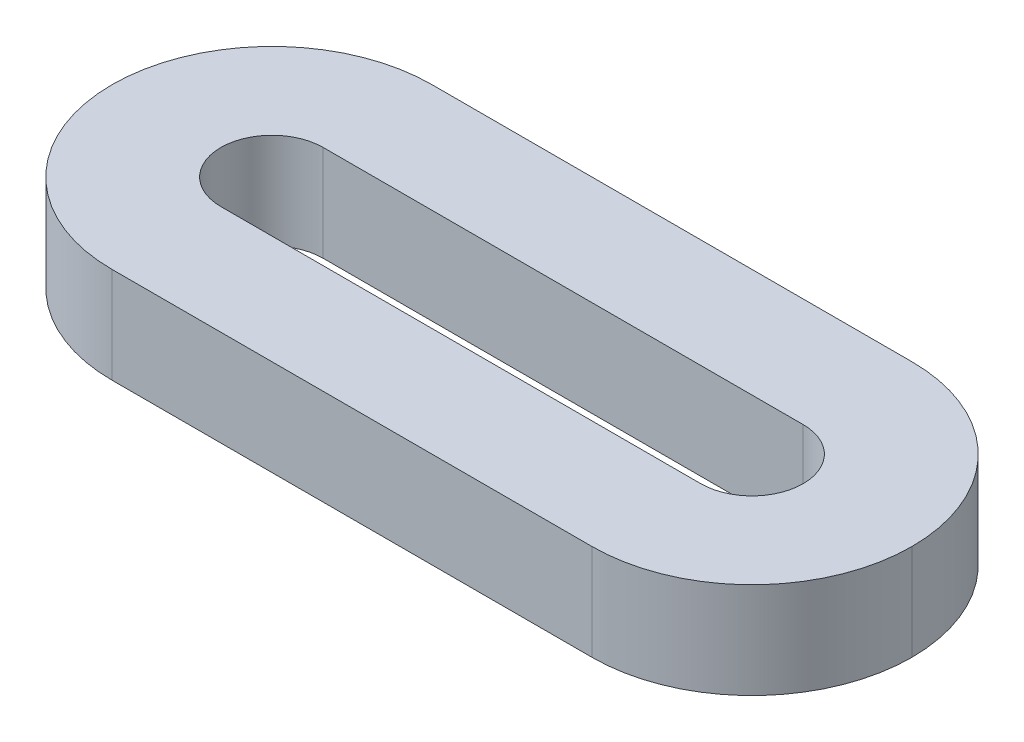
ISO-10303-21;
HEADER;
FILE_DESCRIPTION(('STEP AP214'),'2;1');
FILE_NAME('part.step','',(''),(''),'','','');
FILE_SCHEMA(('AUTOMOTIVE_DESIGN { 1 0 10303 214 1 1 1 1 }'));
ENDSEC;
DATA;
#1=APPLICATION_CONTEXT('core data for automotive mechanical design processes');
#2=APPLICATION_PROTOCOL_DEFINITION('international standard','automotive_design',2000,#1);
#3=PRODUCT_CONTEXT('',#1,'mechanical');
#4=PRODUCT('Part','Part','',(#3));
#5=PRODUCT_RELATED_PRODUCT_CATEGORY('part','',(#4));
#6=PRODUCT_DEFINITION_FORMATION('','',#4);
#7=PRODUCT_DEFINITION_CONTEXT('part definition',#1,'design');
#8=PRODUCT_DEFINITION('design','',#6,#7);
#9=PRODUCT_DEFINITION_SHAPE('','',#8);
#10=(LENGTH_UNIT() NAMED_UNIT(*) SI_UNIT(.MILLI.,.METRE.));
#11=(NAMED_UNIT(*) PLANE_ANGLE_UNIT() SI_UNIT($,.RADIAN.));
#12=(NAMED_UNIT(*) SI_UNIT($,.STERADIAN.) SOLID_ANGLE_UNIT());
#13=UNCERTAINTY_MEASURE_WITH_UNIT(LENGTH_MEASURE(1.E-05),#10,'distance_accuracy_value','');
#14=(GEOMETRIC_REPRESENTATION_CONTEXT(3) GLOBAL_UNCERTAINTY_ASSIGNED_CONTEXT((#13)) GLOBAL_UNIT_ASSIGNED_CONTEXT((#10,
#11,#12)) REPRESENTATION_CONTEXT('',''));
#15=CARTESIAN_POINT('',(0.,0.,0.));
#16=DIRECTION('',(0.,0.,1.));
#17=DIRECTION('',(1.,0.,0.));
#18=AXIS2_PLACEMENT_3D('',#15,#16,#17);
#19=CARTESIAN_POINT('',(0.,3.,0.));
#20=DIRECTION('',(0.,1.,0.));
#21=DIRECTION('',(0.,0.,1.));
#22=AXIS2_PLACEMENT_3D('',#19,#20,#21);
#23=PLANE('',#22);
#24=DIRECTION('',(1.,0.,0.));
#25=VECTOR('',#24,1.);
#26=CARTESIAN_POINT('',(-20.,3.,5.));
#27=LINE('',#26,#25);
#28=CARTESIAN_POINT('',(-15.,3.,5.));
#29=VERTEX_POINT('',#28);
#30=CARTESIAN_POINT('',(0.,3.,5.));
#31=VERTEX_POINT('',#30);
#32=EDGE_CURVE('E181',#29,#31,#27,.T.);
#33=ORIENTED_EDGE('',*,*,#32,.T.);
#34=CARTESIAN_POINT('',(0.,3.,0.));
#35=DIRECTION('',(0.,1.,0.));
#36=DIRECTION('',(0.,0.,1.));
#37=AXIS2_PLACEMENT_3D('',#34,#35,#36);
#38=CIRCLE('',#37,5.);
#39=CARTESIAN_POINT('',(5.,3.,0.));
#40=VERTEX_POINT('',#39);
#41=EDGE_CURVE('E221',#31,#40,#38,.T.);
#42=ORIENTED_EDGE('',*,*,#41,.T.);
#43=CARTESIAN_POINT('',(0.,3.,0.));
#44=DIRECTION('',(0.,1.,0.));
#45=DIRECTION('',(0.,0.,1.));
#46=AXIS2_PLACEMENT_3D('',#43,#44,#45);
#47=CIRCLE('',#46,5.);
#48=CARTESIAN_POINT('',(0.,3.,-5.));
#49=VERTEX_POINT('',#48);
#50=EDGE_CURVE('E71',#40,#49,#47,.T.);
#51=ORIENTED_EDGE('',*,*,#50,.T.);
#52=DIRECTION('',(-1.,0.,0.));
#53=VECTOR('',#52,1.);
#54=CARTESIAN_POINT('',(-20.,3.,-5.));
#55=LINE('',#54,#53);
#56=CARTESIAN_POINT('',(-15.,3.,-5.));
#57=VERTEX_POINT('',#56);
#58=EDGE_CURVE('E185',#49,#57,#55,.T.);
#59=ORIENTED_EDGE('',*,*,#58,.T.);
#60=CARTESIAN_POINT('',(-15.,3.,0.));
#61=DIRECTION('',(0.,1.,0.));
#62=DIRECTION('',(0.,0.,1.));
#63=AXIS2_PLACEMENT_3D('',#60,#61,#62);
#64=CIRCLE('',#63,5.);
#65=CARTESIAN_POINT('',(-20.,3.,0.));
#66=VERTEX_POINT('',#65);
#67=EDGE_CURVE('E63',#57,#66,#64,.T.);
#68=ORIENTED_EDGE('',*,*,#67,.T.);
#69=CARTESIAN_POINT('',(-15.,3.,0.));
#70=DIRECTION('',(0.,1.,0.));
#71=DIRECTION('',(0.,0.,1.));
#72=AXIS2_PLACEMENT_3D('',#69,#70,#71);
#73=CIRCLE('',#72,5.);
#74=EDGE_CURVE('E214',#66,#29,#73,.T.);
#75=ORIENTED_EDGE('',*,*,#74,.T.);
#76=EDGE_LOOP('',(#33,#42,#51,#59,#68,#75));
#77=FACE_BOUND('',#76,.T.);
#78=DIRECTION('',(-1.,0.,0.));
#79=VECTOR('',#78,1.);
#80=CARTESIAN_POINT('',(0.,3.,-1.6));
#81=LINE('',#80,#79);
#82=CARTESIAN_POINT('',(0.,3.,-1.6));
#83=VERTEX_POINT('',#82);
#84=CARTESIAN_POINT('',(-15.,3.,-1.6));
#85=VERTEX_POINT('',#84);
#86=EDGE_CURVE('E138',#83,#85,#81,.T.);
#87=ORIENTED_EDGE('',*,*,#86,.F.);
#88=CARTESIAN_POINT('',(0.,3.,0.));
#89=DIRECTION('',(0.,1.,0.));
#90=DIRECTION('',(0.,0.,1.));
#91=AXIS2_PLACEMENT_3D('',#88,#89,#90);
#92=CIRCLE('',#91,1.6);
#93=CARTESIAN_POINT('',(0.,3.,1.6));
#94=VERTEX_POINT('',#93);
#95=EDGE_CURVE('E127',#94,#83,#92,.T.);
#96=ORIENTED_EDGE('',*,*,#95,.F.);
#97=DIRECTION('',(1.,0.,0.));
#98=VECTOR('',#97,1.);
#99=CARTESIAN_POINT('',(0.,3.,1.6));
#100=LINE('',#99,#98);
#101=CARTESIAN_POINT('',(-15.,3.,1.6));
#102=VERTEX_POINT('',#101);
#103=EDGE_CURVE('E156',#102,#94,#100,.T.);
#104=ORIENTED_EDGE('',*,*,#103,.F.);
#105=CARTESIAN_POINT('',(-15.,3.,0.));
#106=DIRECTION('',(0.,1.,0.));
#107=DIRECTION('',(0.,0.,1.));
#108=AXIS2_PLACEMENT_3D('',#105,#106,#107);
#109=CIRCLE('',#108,1.6);
#110=EDGE_CURVE('E152',#85,#102,#109,.T.);
#111=ORIENTED_EDGE('',*,*,#110,.F.);
#112=EDGE_LOOP('',(#87,#96,#104,#111));
#113=FACE_BOUND('',#112,.T.);
#114=ADVANCED_FACE('F45',(#77,#113),#23,.T.);
#115=CARTESIAN_POINT('',(0.,0.,0.));
#116=DIRECTION('',(0.,1.,0.));
#117=DIRECTION('',(0.,0.,1.));
#118=AXIS2_PLACEMENT_3D('',#115,#116,#117);
#119=PLANE('',#118);
#120=CARTESIAN_POINT('',(0.,0.,0.));
#121=DIRECTION('',(0.,1.,0.));
#122=DIRECTION('',(0.,0.,1.));
#123=AXIS2_PLACEMENT_3D('',#120,#121,#122);
#124=CIRCLE('',#123,5.);
#125=CARTESIAN_POINT('',(0.,0.,-5.));
#126=VERTEX_POINT('',#125);
#127=CARTESIAN_POINT('',(5.,0.,0.));
#128=VERTEX_POINT('',#127);
#129=EDGE_CURVE('E201',#126,#128,#124,.F.);
#130=ORIENTED_EDGE('',*,*,#129,.T.);
#131=CARTESIAN_POINT('',(0.,0.,0.));
#132=DIRECTION('',(0.,1.,0.));
#133=DIRECTION('',(0.,0.,1.));
#134=AXIS2_PLACEMENT_3D('',#131,#132,#133);
#135=CIRCLE('',#134,5.);
#136=CARTESIAN_POINT('',(0.,0.,5.));
#137=VERTEX_POINT('',#136);
#138=EDGE_CURVE('E204',#128,#137,#135,.F.);
#139=ORIENTED_EDGE('',*,*,#138,.T.);
#140=DIRECTION('',(1.,0.,0.));
#141=VECTOR('',#140,1.);
#142=CARTESIAN_POINT('',(-20.,0.,5.));
#143=LINE('',#142,#141);
#144=CARTESIAN_POINT('',(-15.,0.,5.));
#145=VERTEX_POINT('',#144);
#146=EDGE_CURVE('E147',#145,#137,#143,.T.);
#147=ORIENTED_EDGE('',*,*,#146,.F.);
#148=CARTESIAN_POINT('',(-15.,0.,0.));
#149=DIRECTION('',(0.,1.,0.));
#150=DIRECTION('',(0.,0.,1.));
#151=AXIS2_PLACEMENT_3D('',#148,#149,#150);
#152=CIRCLE('',#151,5.);
#153=CARTESIAN_POINT('',(-20.,0.,0.));
#154=VERTEX_POINT('',#153);
#155=EDGE_CURVE('E189',#145,#154,#152,.F.);
#156=ORIENTED_EDGE('',*,*,#155,.T.);
#157=CARTESIAN_POINT('',(-15.,0.,0.));
#158=DIRECTION('',(0.,1.,0.));
#159=DIRECTION('',(0.,0.,1.));
#160=AXIS2_PLACEMENT_3D('',#157,#158,#159);
#161=CIRCLE('',#160,5.);
#162=CARTESIAN_POINT('',(-15.,0.,-5.));
#163=VERTEX_POINT('',#162);
#164=EDGE_CURVE('E198',#154,#163,#161,.F.);
#165=ORIENTED_EDGE('',*,*,#164,.T.);
#166=DIRECTION('',(-1.,0.,0.));
#167=VECTOR('',#166,1.);
#168=CARTESIAN_POINT('',(-20.,0.,-5.));
#169=LINE('',#168,#167);
#170=EDGE_CURVE('E186',#126,#163,#169,.T.);
#171=ORIENTED_EDGE('',*,*,#170,.F.);
#172=EDGE_LOOP('',(#130,#139,#147,#156,#165,#171));
#173=FACE_BOUND('',#172,.T.);
#174=CARTESIAN_POINT('',(0.,0.,0.));
#175=DIRECTION('',(0.,1.,0.));
#176=DIRECTION('',(0.,0.,1.));
#177=AXIS2_PLACEMENT_3D('',#174,#175,#176);
#178=CIRCLE('',#177,1.6);
#179=CARTESIAN_POINT('',(0.,0.,1.6));
#180=VERTEX_POINT('',#179);
#181=CARTESIAN_POINT('',(0.,0.,-1.6));
#182=VERTEX_POINT('',#181);
#183=EDGE_CURVE('E161',#180,#182,#178,.T.);
#184=ORIENTED_EDGE('',*,*,#183,.T.);
#185=DIRECTION('',(-1.,0.,0.));
#186=VECTOR('',#185,1.);
#187=CARTESIAN_POINT('',(0.,0.,-1.6));
#188=LINE('',#187,#186);
#189=CARTESIAN_POINT('',(-15.,0.,-1.6));
#190=VERTEX_POINT('',#189);
#191=EDGE_CURVE('E145',#182,#190,#188,.T.);
#192=ORIENTED_EDGE('',*,*,#191,.T.);
#193=CARTESIAN_POINT('',(-15.,0.,0.));
#194=DIRECTION('',(0.,1.,0.));
#195=DIRECTION('',(0.,0.,1.));
#196=AXIS2_PLACEMENT_3D('',#193,#194,#195);
#197=CIRCLE('',#196,1.6);
#198=CARTESIAN_POINT('',(-15.,0.,1.6));
#199=VERTEX_POINT('',#198);
#200=EDGE_CURVE('E167',#190,#199,#197,.T.);
#201=ORIENTED_EDGE('',*,*,#200,.T.);
#202=DIRECTION('',(1.,0.,0.));
#203=VECTOR('',#202,1.);
#204=CARTESIAN_POINT('',(0.,0.,1.6));
#205=LINE('',#204,#203);
#206=EDGE_CURVE('E139',#199,#180,#205,.T.);
#207=ORIENTED_EDGE('',*,*,#206,.T.);
#208=EDGE_LOOP('',(#184,#192,#201,#207));
#209=FACE_BOUND('',#208,.T.);
#210=ADVANCED_FACE('F252',(#173,#209),#119,.F.);
#211=CARTESIAN_POINT('',(-20.,3.,5.));
#212=DIRECTION('',(0.,0.,-1.));
#213=DIRECTION('',(-1.,0.,0.));
#214=AXIS2_PLACEMENT_3D('',#211,#212,#213);
#215=PLANE('',#214);
#216=ORIENTED_EDGE('',*,*,#146,.T.);
#217=DIRECTION('',(0.,-1.,0.));
#218=VECTOR('',#217,1.);
#219=CARTESIAN_POINT('',(0.,3.,5.));
#220=LINE('',#219,#218);
#221=EDGE_CURVE('E210',#137,#31,#220,.F.);
#222=ORIENTED_EDGE('',*,*,#221,.T.);
#223=ORIENTED_EDGE('',*,*,#32,.F.);
#224=DIRECTION('',(0.,-1.,0.));
#225=VECTOR('',#224,1.);
#226=CARTESIAN_POINT('',(-15.,3.,5.));
#227=LINE('',#226,#225);
#228=EDGE_CURVE('E207',#29,#145,#227,.T.);
#229=ORIENTED_EDGE('',*,*,#228,.T.);
#230=EDGE_LOOP('',(#216,#222,#223,#229));
#231=FACE_BOUND('',#230,.T.);
#232=ADVANCED_FACE('F240',(#231),#215,.F.);
#233=CARTESIAN_POINT('',(-20.,3.,-5.));
#234=DIRECTION('',(0.,0.,1.));
#235=DIRECTION('',(1.,0.,0.));
#236=AXIS2_PLACEMENT_3D('',#233,#234,#235);
#237=PLANE('',#236);
#238=ORIENTED_EDGE('',*,*,#58,.F.);
#239=DIRECTION('',(0.,-1.,0.));
#240=VECTOR('',#239,1.);
#241=CARTESIAN_POINT('',(0.,3.,-5.));
#242=LINE('',#241,#240);
#243=EDGE_CURVE('E11',#49,#126,#242,.T.);
#244=ORIENTED_EDGE('',*,*,#243,.T.);
#245=ORIENTED_EDGE('',*,*,#170,.T.);
#246=DIRECTION('',(0.,-1.,0.));
#247=VECTOR('',#246,1.);
#248=CARTESIAN_POINT('',(-15.,3.,-5.));
#249=LINE('',#248,#247);
#250=EDGE_CURVE('E55',#163,#57,#249,.F.);
#251=ORIENTED_EDGE('',*,*,#250,.T.);
#252=EDGE_LOOP('',(#238,#244,#245,#251));
#253=FACE_BOUND('',#252,.T.);
#254=ADVANCED_FACE('F250',(#253),#237,.F.);
#255=CARTESIAN_POINT('',(0.,3.,0.));
#256=DIRECTION('',(0.,-1.,0.));
#257=DIRECTION('',(0.,0.,-1.));
#258=AXIS2_PLACEMENT_3D('',#255,#256,#257);
#259=CYLINDRICAL_SURFACE('',#258,1.6);
#260=ORIENTED_EDGE('',*,*,#183,.F.);
#261=DIRECTION('',(0.,-1.,0.));
#262=VECTOR('',#261,1.);
#263=CARTESIAN_POINT('',(0.,3.,1.6));
#264=LINE('',#263,#262);
#265=EDGE_CURVE('E133',#94,#180,#264,.T.);
#266=ORIENTED_EDGE('',*,*,#265,.F.);
#267=ORIENTED_EDGE('',*,*,#95,.T.);
#268=DIRECTION('',(0.,-1.,0.));
#269=VECTOR('',#268,1.);
#270=CARTESIAN_POINT('',(0.,3.,-1.6));
#271=LINE('',#270,#269);
#272=EDGE_CURVE('E130',#83,#182,#271,.T.);
#273=ORIENTED_EDGE('',*,*,#272,.T.);
#274=EDGE_LOOP('',(#260,#266,#267,#273));
#275=FACE_BOUND('',#274,.T.);
#276=ADVANCED_FACE('F129',(#275),#259,.F.);
#277=CARTESIAN_POINT('',(0.,3.,-1.6));
#278=DIRECTION('',(0.,0.,1.));
#279=DIRECTION('',(1.,0.,0.));
#280=AXIS2_PLACEMENT_3D('',#277,#278,#279);
#281=PLANE('',#280);
#282=ORIENTED_EDGE('',*,*,#191,.F.);
#283=ORIENTED_EDGE('',*,*,#272,.F.);
#284=ORIENTED_EDGE('',*,*,#86,.T.);
#285=DIRECTION('',(0.,-1.,0.));
#286=VECTOR('',#285,1.);
#287=CARTESIAN_POINT('',(-15.,3.,-1.6));
#288=LINE('',#287,#286);
#289=EDGE_CURVE('E148',#85,#190,#288,.T.);
#290=ORIENTED_EDGE('',*,*,#289,.T.);
#291=EDGE_LOOP('',(#282,#283,#284,#290));
#292=FACE_BOUND('',#291,.T.);
#293=ADVANCED_FACE('F142',(#292),#281,.T.);
#294=CARTESIAN_POINT('',(-15.,3.,0.));
#295=DIRECTION('',(0.,-1.,0.));
#296=DIRECTION('',(0.,0.,-1.));
#297=AXIS2_PLACEMENT_3D('',#294,#295,#296);
#298=CYLINDRICAL_SURFACE('',#297,1.6);
#299=ORIENTED_EDGE('',*,*,#200,.F.);
#300=ORIENTED_EDGE('',*,*,#289,.F.);
#301=ORIENTED_EDGE('',*,*,#110,.T.);
#302=DIRECTION('',(0.,-1.,0.));
#303=VECTOR('',#302,1.);
#304=CARTESIAN_POINT('',(-15.,3.,1.6));
#305=LINE('',#304,#303);
#306=EDGE_CURVE('E176',#102,#199,#305,.T.);
#307=ORIENTED_EDGE('',*,*,#306,.T.);
#308=EDGE_LOOP('',(#299,#300,#301,#307));
#309=FACE_BOUND('',#308,.T.);
#310=ADVANCED_FACE('F261',(#309),#298,.F.);
#311=CARTESIAN_POINT('',(0.,3.,1.6));
#312=DIRECTION('',(0.,0.,-1.));
#313=DIRECTION('',(-1.,0.,0.));
#314=AXIS2_PLACEMENT_3D('',#311,#312,#313);
#315=PLANE('',#314);
#316=ORIENTED_EDGE('',*,*,#206,.F.);
#317=ORIENTED_EDGE('',*,*,#306,.F.);
#318=ORIENTED_EDGE('',*,*,#103,.T.);
#319=ORIENTED_EDGE('',*,*,#265,.T.);
#320=EDGE_LOOP('',(#316,#317,#318,#319));
#321=FACE_BOUND('',#320,.T.);
#322=ADVANCED_FACE('F258',(#321),#315,.T.);
#323=CARTESIAN_POINT('',(0.,3.,0.));
#324=DIRECTION('',(0.,-1.,0.));
#325=DIRECTION('',(0.,0.,-1.));
#326=AXIS2_PLACEMENT_3D('',#323,#324,#325);
#327=CYLINDRICAL_SURFACE('',#326,5.);
#328=ORIENTED_EDGE('',*,*,#243,.F.);
#329=ORIENTED_EDGE('',*,*,#50,.F.);
#330=DIRECTION('',(0.,-1.,0.));
#331=VECTOR('',#330,1.);
#332=CARTESIAN_POINT('',(5.,3.,0.));
#333=LINE('',#332,#331);
#334=EDGE_CURVE('E164',#128,#40,#333,.F.);
#335=ORIENTED_EDGE('',*,*,#334,.F.);
#336=ORIENTED_EDGE('',*,*,#129,.F.);
#337=EDGE_LOOP('',(#328,#329,#335,#336));
#338=FACE_BOUND('',#337,.T.);
#339=ADVANCED_FACE('F246',(#338),#327,.T.);
#340=CARTESIAN_POINT('',(0.,3.,0.));
#341=DIRECTION('',(0.,-1.,0.));
#342=DIRECTION('',(0.,0.,-1.));
#343=AXIS2_PLACEMENT_3D('',#340,#341,#342);
#344=CYLINDRICAL_SURFACE('',#343,5.);
#345=ORIENTED_EDGE('',*,*,#41,.F.);
#346=ORIENTED_EDGE('',*,*,#221,.F.);
#347=ORIENTED_EDGE('',*,*,#138,.F.);
#348=ORIENTED_EDGE('',*,*,#334,.T.);
#349=EDGE_LOOP('',(#345,#346,#347,#348));
#350=FACE_BOUND('',#349,.T.);
#351=ADVANCED_FACE('F243',(#350),#344,.T.);
#352=CARTESIAN_POINT('',(-15.,3.,0.));
#353=DIRECTION('',(0.,-1.,0.));
#354=DIRECTION('',(0.,0.,-1.));
#355=AXIS2_PLACEMENT_3D('',#352,#353,#354);
#356=CYLINDRICAL_SURFACE('',#355,5.);
#357=ORIENTED_EDGE('',*,*,#228,.F.);
#358=ORIENTED_EDGE('',*,*,#74,.F.);
#359=DIRECTION('',(0.,-1.,0.));
#360=VECTOR('',#359,1.);
#361=CARTESIAN_POINT('',(-20.,3.,0.));
#362=LINE('',#361,#360);
#363=EDGE_CURVE('E49',#154,#66,#362,.F.);
#364=ORIENTED_EDGE('',*,*,#363,.F.);
#365=ORIENTED_EDGE('',*,*,#155,.F.);
#366=EDGE_LOOP('',(#357,#358,#364,#365));
#367=FACE_BOUND('',#366,.T.);
#368=ADVANCED_FACE('F47',(#367),#356,.T.);
#369=CARTESIAN_POINT('',(-15.,3.,0.));
#370=DIRECTION('',(0.,-1.,0.));
#371=DIRECTION('',(0.,0.,-1.));
#372=AXIS2_PLACEMENT_3D('',#369,#370,#371);
#373=CYLINDRICAL_SURFACE('',#372,5.);
#374=ORIENTED_EDGE('',*,*,#67,.F.);
#375=ORIENTED_EDGE('',*,*,#250,.F.);
#376=ORIENTED_EDGE('',*,*,#164,.F.);
#377=ORIENTED_EDGE('',*,*,#363,.T.);
#378=EDGE_LOOP('',(#374,#375,#376,#377));
#379=FACE_BOUND('',#378,.T.);
#380=ADVANCED_FACE('F233',(#379),#373,.T.);
#381=CLOSED_SHELL('',(#114,#210,#232,#254,#276,#293,#310,#322,#339,#351,#368,#380));
#382=MANIFOLD_SOLID_BREP('B2',#381);
#383=ADVANCED_BREP_SHAPE_REPRESENTATION('',(#18,#382),#14);
#384=SHAPE_DEFINITION_REPRESENTATION(#9,#383);
ENDSEC;
END-ISO-10303-21;
